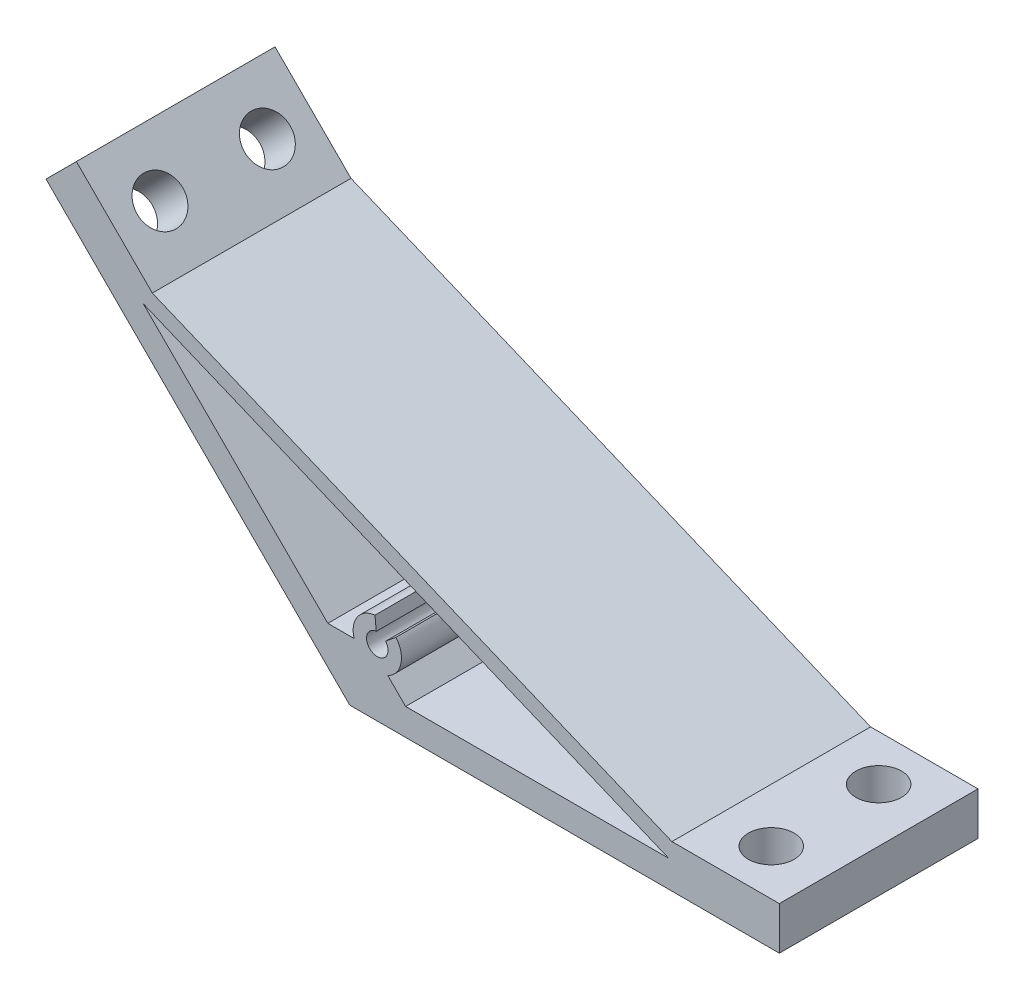
ISO-10303-21;
HEADER;
FILE_DESCRIPTION(('STEP AP214'),'2;1');
FILE_NAME('part.step','',(''),(''),'','','');
FILE_SCHEMA(('AUTOMOTIVE_DESIGN { 1 0 10303 214 1 1 1 1 }'));
ENDSEC;
DATA;
#1=APPLICATION_CONTEXT('core data for automotive mechanical design processes');
#2=APPLICATION_PROTOCOL_DEFINITION('international standard','automotive_design',2000,#1);
#3=PRODUCT_CONTEXT('',#1,'mechanical');
#4=PRODUCT('Part','Part','',(#3));
#5=PRODUCT_RELATED_PRODUCT_CATEGORY('part','',(#4));
#6=PRODUCT_DEFINITION_FORMATION('','',#4);
#7=PRODUCT_DEFINITION_CONTEXT('part definition',#1,'design');
#8=PRODUCT_DEFINITION('design','',#6,#7);
#9=PRODUCT_DEFINITION_SHAPE('','',#8);
#10=(LENGTH_UNIT() NAMED_UNIT(*) SI_UNIT(.MILLI.,.METRE.));
#11=(NAMED_UNIT(*) PLANE_ANGLE_UNIT() SI_UNIT($,.RADIAN.));
#12=(NAMED_UNIT(*) SI_UNIT($,.STERADIAN.) SOLID_ANGLE_UNIT());
#13=UNCERTAINTY_MEASURE_WITH_UNIT(LENGTH_MEASURE(1.E-05),#10,'distance_accuracy_value','');
#14=(GEOMETRIC_REPRESENTATION_CONTEXT(3) GLOBAL_UNCERTAINTY_ASSIGNED_CONTEXT((#13)) GLOBAL_UNIT_ASSIGNED_CONTEXT((#10,
#11,#12)) REPRESENTATION_CONTEXT('',''));
#15=CARTESIAN_POINT('',(0.,0.,0.));
#16=DIRECTION('',(0.,0.,1.));
#17=DIRECTION('',(1.,0.,0.));
#18=AXIS2_PLACEMENT_3D('',#15,#16,#17);
#19=CARTESIAN_POINT('',(580.06230191566,1400.39427630612,18.5));
#20=DIRECTION('',(0.382683432365095,0.923879532511285,0.));
#21=DIRECTION('',(-0.923879532511285,0.382683432365095,0.));
#22=AXIS2_PLACEMENT_3D('',#19,#20,#21);
#23=PLANE('',#22);
#24=DIRECTION('',(0.923879532511285,-0.382683432365095,0.));
#25=VECTOR('',#24,1.);
#26=CARTESIAN_POINT('',(580.06230191566,1400.39427630612,-18.5));
#27=LINE('',#26,#25);
#28=CARTESIAN_POINT('',(6955.91811216156,-1240.57167203307,-18.5));
#29=VERTEX_POINT('',#28);
#30=CARTESIAN_POINT('',(7052.68766478326,-1280.65493315376,-18.5));
#31=VERTEX_POINT('',#30);
#32=EDGE_CURVE('E233',#29,#31,#27,.T.);
#33=ORIENTED_EDGE('',*,*,#32,.F.);
#34=DIRECTION('',(0.,0.,-1.));
#35=VECTOR('',#34,1.);
#36=CARTESIAN_POINT('',(6955.91811216156,-1240.57167203307,18.5));
#37=LINE('',#36,#35);
#38=CARTESIAN_POINT('',(6955.91811216156,-1240.57167203307,18.5));
#39=VERTEX_POINT('',#38);
#40=EDGE_CURVE('E11',#39,#29,#37,.T.);
#41=ORIENTED_EDGE('',*,*,#40,.F.);
#42=DIRECTION('',(0.923879532511285,-0.382683432365095,0.));
#43=VECTOR('',#42,1.);
#44=CARTESIAN_POINT('',(580.06230191566,1400.39427630612,18.5));
#45=LINE('',#44,#43);
#46=CARTESIAN_POINT('',(7052.68766478326,-1280.65493315376,18.5));
#47=VERTEX_POINT('',#46);
#48=EDGE_CURVE('E270',#39,#47,#45,.T.);
#49=ORIENTED_EDGE('',*,*,#48,.T.);
#50=DIRECTION('',(0.,0.,-1.));
#51=VECTOR('',#50,1.);
#52=CARTESIAN_POINT('',(7052.68766478326,-1280.65493315376,18.5));
#53=LINE('',#52,#51);
#54=EDGE_CURVE('E54',#47,#31,#53,.T.);
#55=ORIENTED_EDGE('',*,*,#54,.T.);
#56=EDGE_LOOP('',(#33,#41,#49,#55));
#57=FACE_BOUND('',#56,.T.);
#58=ADVANCED_FACE('F35',(#57),#23,.T.);
#59=CARTESIAN_POINT('',(2857.67322006435,2857.67322006426,18.5));
#60=DIRECTION('',(-0.707106781186559,-0.707106781186536,0.));
#61=DIRECTION('',(0.707106781186536,-0.707106781186559,0.));
#62=AXIS2_PLACEMENT_3D('',#59,#60,#61);
#63=PLANE('',#62);
#64=CARTESIAN_POINT('',(6948.84704434969,-1233.50060422121,-10.));
#65=DIRECTION('',(-0.707106781186559,-0.707106781186536,0.));
#66=DIRECTION('',(0.707106781186536,-0.707106781186559,0.));
#67=AXIS2_PLACEMENT_3D('',#64,#65,#66);
#68=CIRCLE('',#67,4.24999999999998);
#69=CARTESIAN_POINT('',(6951.85224816974,-1236.50580804125,-10.));
#70=VERTEX_POINT('',#69);
#71=EDGE_CURVE('E299',#70,#70,#68,.T.);
#72=ORIENTED_EDGE('',*,*,#71,.T.);
#73=EDGE_LOOP('',(#72));
#74=FACE_BOUND('',#73,.T.);
#75=CARTESIAN_POINT('',(6948.84704434969,-1233.50060422121,10.));
#76=DIRECTION('',(-0.707106781186559,-0.707106781186536,0.));
#77=DIRECTION('',(0.707106781186536,-0.707106781186559,0.));
#78=AXIS2_PLACEMENT_3D('',#75,#76,#77);
#79=CIRCLE('',#78,4.24999999999998);
#80=CARTESIAN_POINT('',(6951.85224816974,-1236.50580804125,10.));
#81=VERTEX_POINT('',#80);
#82=EDGE_CURVE('E262',#81,#81,#79,.T.);
#83=ORIENTED_EDGE('',*,*,#82,.T.);
#84=EDGE_LOOP('',(#83));
#85=FACE_BOUND('',#84,.T.);
#86=DIRECTION('',(-0.707106781186536,0.707106781186559,0.));
#87=VECTOR('',#86,1.);
#88=CARTESIAN_POINT('',(2857.67322006435,2857.67322006426,-18.5));
#89=LINE('',#88,#87);
#90=CARTESIAN_POINT('',(6941.77597653783,-1226.42953640934,-18.5));
#91=VERTEX_POINT('',#90);
#92=EDGE_CURVE('E230',#29,#91,#89,.T.);
#93=ORIENTED_EDGE('',*,*,#92,.T.);
#94=DIRECTION('',(0.,0.,-1.));
#95=VECTOR('',#94,1.);
#96=CARTESIAN_POINT('',(6941.77597653783,-1226.42953640934,18.5));
#97=LINE('',#96,#95);
#98=CARTESIAN_POINT('',(6941.77597653783,-1226.42953640934,18.5));
#99=VERTEX_POINT('',#98);
#100=EDGE_CURVE('E45',#99,#91,#97,.T.);
#101=ORIENTED_EDGE('',*,*,#100,.F.);
#102=DIRECTION('',(-0.707106781186536,0.707106781186559,0.));
#103=VECTOR('',#102,1.);
#104=CARTESIAN_POINT('',(2857.67322006435,2857.67322006426,18.5));
#105=LINE('',#104,#103);
#106=EDGE_CURVE('E268',#39,#99,#105,.T.);
#107=ORIENTED_EDGE('',*,*,#106,.F.);
#108=ORIENTED_EDGE('',*,*,#40,.T.);
#109=EDGE_LOOP('',(#93,#101,#107,#108));
#110=FACE_BOUND('',#109,.T.);
#111=ADVANCED_FACE('F332',(#74,#85,#110),#63,.F.);
#112=CARTESIAN_POINT('',(4084.10275647372,-4084.10275647356,18.5));
#113=DIRECTION('',(-0.707106781186561,0.707106781186534,0.));
#114=DIRECTION('',(-0.707106781186534,-0.707106781186561,0.));
#115=AXIS2_PLACEMENT_3D('',#112,#113,#114);
#116=PLANE('',#115);
#117=DIRECTION('',(0.707106781186534,0.707106781186561,0.));
#118=VECTOR('',#117,1.);
#119=CARTESIAN_POINT('',(4084.10275647372,-4084.10275647356,-18.5));
#120=LINE('',#119,#118);
#121=CARTESIAN_POINT('',(6936.11912228834,-1232.08639065884,-18.5));
#122=VERTEX_POINT('',#121);
#123=EDGE_CURVE('E227',#122,#91,#120,.T.);
#124=ORIENTED_EDGE('',*,*,#123,.F.);
#125=DIRECTION('',(0.,0.,-1.));
#126=VECTOR('',#125,1.);
#127=CARTESIAN_POINT('',(6936.11912228834,-1232.08639065884,18.5));
#128=LINE('',#127,#126);
#129=CARTESIAN_POINT('',(6936.11912228834,-1232.08639065884,18.5));
#130=VERTEX_POINT('',#129);
#131=EDGE_CURVE('E187',#130,#122,#128,.T.);
#132=ORIENTED_EDGE('',*,*,#131,.F.);
#133=DIRECTION('',(0.707106781186534,0.707106781186561,0.));
#134=VECTOR('',#133,1.);
#135=CARTESIAN_POINT('',(4084.10275647372,-4084.10275647356,18.5));
#136=LINE('',#135,#134);
#137=EDGE_CURVE('E265',#130,#99,#136,.T.);
#138=ORIENTED_EDGE('',*,*,#137,.T.);
#139=ORIENTED_EDGE('',*,*,#100,.T.);
#140=EDGE_LOOP('',(#124,#132,#138,#139));
#141=FACE_BOUND('',#140,.T.);
#142=ADVANCED_FACE('F338',(#141),#116,.T.);
#143=CARTESIAN_POINT('',(2852.0163658146,2852.01636581472,18.5));
#144=DIRECTION('',(-0.707106781186532,-0.707106781186563,0.));
#145=DIRECTION('',(0.707106781186563,-0.707106781186532,0.));
#146=AXIS2_PLACEMENT_3D('',#143,#144,#145);
#147=PLANE('',#146);
#148=CARTESIAN_POINT('',(6943.1901901002,-1239.1574584707,-10.));
#149=DIRECTION('',(-0.707106781186532,-0.707106781186563,0.));
#150=DIRECTION('',(0.707106781186563,-0.707106781186532,0.));
#151=AXIS2_PLACEMENT_3D('',#148,#149,#150);
#152=CIRCLE('',#151,4.24999999999999);
#153=CARTESIAN_POINT('',(6946.19539392024,-1242.16266229074,-10.));
#154=VERTEX_POINT('',#153);
#155=EDGE_CURVE('E302',#154,#154,#152,.T.);
#156=ORIENTED_EDGE('',*,*,#155,.F.);
#157=EDGE_LOOP('',(#156));
#158=FACE_BOUND('',#157,.T.);
#159=CARTESIAN_POINT('',(6943.1901901002,-1239.1574584707,10.));
#160=DIRECTION('',(-0.707106781186532,-0.707106781186563,0.));
#161=DIRECTION('',(0.707106781186563,-0.707106781186532,0.));
#162=AXIS2_PLACEMENT_3D('',#159,#160,#161);
#163=CIRCLE('',#162,4.24999999999999);
#164=CARTESIAN_POINT('',(6946.19539392024,-1242.16266229074,10.));
#165=VERTEX_POINT('',#164);
#166=EDGE_CURVE('E296',#165,#165,#163,.T.);
#167=ORIENTED_EDGE('',*,*,#166,.F.);
#168=EDGE_LOOP('',(#167));
#169=FACE_BOUND('',#168,.T.);
#170=DIRECTION('',(-0.707106781186563,0.707106781186532,0.));
#171=VECTOR('',#170,1.);
#172=CARTESIAN_POINT('',(2852.0163658146,2852.01636581472,-18.5));
#173=LINE('',#172,#171);
#174=CARTESIAN_POINT('',(6992.68766478326,-1288.65493315376,-18.5));
#175=VERTEX_POINT('',#174);
#176=EDGE_CURVE('E224',#175,#122,#173,.T.);
#177=ORIENTED_EDGE('',*,*,#176,.F.);
#178=DIRECTION('',(0.,0.,-1.));
#179=VECTOR('',#178,1.);
#180=CARTESIAN_POINT('',(6992.68766478326,-1288.65493315376,18.5));
#181=LINE('',#180,#179);
#182=CARTESIAN_POINT('',(6992.68766478326,-1288.65493315376,18.5));
#183=VERTEX_POINT('',#182);
#184=EDGE_CURVE('E185',#183,#175,#181,.T.);
#185=ORIENTED_EDGE('',*,*,#184,.F.);
#186=DIRECTION('',(-0.707106781186563,0.707106781186532,0.));
#187=VECTOR('',#186,1.);
#188=CARTESIAN_POINT('',(2852.0163658146,2852.01636581472,18.5));
#189=LINE('',#188,#187);
#190=EDGE_CURVE('E179',#183,#130,#189,.T.);
#191=ORIENTED_EDGE('',*,*,#190,.T.);
#192=ORIENTED_EDGE('',*,*,#131,.T.);
#193=EDGE_LOOP('',(#177,#185,#191,#192));
#194=FACE_BOUND('',#193,.T.);
#195=ADVANCED_FACE('F336',(#158,#169,#194),#147,.T.);
#196=CARTESIAN_POINT('',(0.,-1288.65493315376,18.5));
#197=DIRECTION('',(0.,1.,0.));
#198=DIRECTION('',(0.,0.,1.));
#199=AXIS2_PLACEMENT_3D('',#196,#197,#198);
#200=PLANE('',#199);
#201=CARTESIAN_POINT('',(7062.68766478326,-1288.65493315377,-10.));
#202=DIRECTION('',(0.,-1.,0.));
#203=DIRECTION('',(0.,0.,-1.));
#204=AXIS2_PLACEMENT_3D('',#201,#202,#203);
#205=CIRCLE('',#204,4.24999999999986);
#206=CARTESIAN_POINT('',(7062.68766478326,-1288.65493315377,-14.2499999999999));
#207=VERTEX_POINT('',#206);
#208=EDGE_CURVE('E311',#207,#207,#205,.T.);
#209=ORIENTED_EDGE('',*,*,#208,.F.);
#210=EDGE_LOOP('',(#209));
#211=FACE_BOUND('',#210,.T.);
#212=CARTESIAN_POINT('',(7062.68766478326,-1288.65493315377,10.));
#213=DIRECTION('',(0.,-1.,0.));
#214=DIRECTION('',(0.,0.,-1.));
#215=AXIS2_PLACEMENT_3D('',#212,#213,#214);
#216=CIRCLE('',#215,4.24999999999986);
#217=CARTESIAN_POINT('',(7062.68766478326,-1288.65493315377,5.75000000000014));
#218=VERTEX_POINT('',#217);
#219=EDGE_CURVE('E308',#218,#218,#216,.T.);
#220=ORIENTED_EDGE('',*,*,#219,.F.);
#221=EDGE_LOOP('',(#220));
#222=FACE_BOUND('',#221,.T.);
#223=DIRECTION('',(1.,0.,0.));
#224=VECTOR('',#223,1.);
#225=CARTESIAN_POINT('',(0.,-1288.65493315376,-18.5));
#226=LINE('',#225,#224);
#227=CARTESIAN_POINT('',(7072.68766478326,-1288.65493315376,-18.5));
#228=VERTEX_POINT('',#227);
#229=EDGE_CURVE('E184',#175,#228,#226,.T.);
#230=ORIENTED_EDGE('',*,*,#229,.T.);
#231=DIRECTION('',(0.,0.,-1.));
#232=VECTOR('',#231,1.);
#233=CARTESIAN_POINT('',(7072.68766478326,-1288.65493315376,18.5));
#234=LINE('',#233,#232);
#235=CARTESIAN_POINT('',(7072.68766478326,-1288.65493315376,18.5));
#236=VERTEX_POINT('',#235);
#237=EDGE_CURVE('E166',#236,#228,#234,.T.);
#238=ORIENTED_EDGE('',*,*,#237,.F.);
#239=DIRECTION('',(1.,0.,0.));
#240=VECTOR('',#239,1.);
#241=CARTESIAN_POINT('',(0.,-1288.65493315376,18.5));
#242=LINE('',#241,#240);
#243=EDGE_CURVE('E171',#183,#236,#242,.T.);
#244=ORIENTED_EDGE('',*,*,#243,.F.);
#245=ORIENTED_EDGE('',*,*,#184,.T.);
#246=EDGE_LOOP('',(#230,#238,#244,#245));
#247=FACE_BOUND('',#246,.T.);
#248=ADVANCED_FACE('F182',(#211,#222,#247),#200,.F.);
#249=CARTESIAN_POINT('',(7072.68766478326,0.,18.5));
#250=DIRECTION('',(-1.,0.,0.));
#251=DIRECTION('',(0.,0.,1.));
#252=AXIS2_PLACEMENT_3D('',#249,#250,#251);
#253=PLANE('',#252);
#254=DIRECTION('',(0.,1.,0.));
#255=VECTOR('',#254,1.);
#256=CARTESIAN_POINT('',(7072.68766478326,0.,-18.5));
#257=LINE('',#256,#255);
#258=CARTESIAN_POINT('',(7072.68766478326,-1280.65493315376,-18.5));
#259=VERTEX_POINT('',#258);
#260=EDGE_CURVE('E221',#228,#259,#257,.T.);
#261=ORIENTED_EDGE('',*,*,#260,.T.);
#262=DIRECTION('',(0.,0.,-1.));
#263=VECTOR('',#262,1.);
#264=CARTESIAN_POINT('',(7072.68766478326,-1280.65493315376,18.5));
#265=LINE('',#264,#263);
#266=CARTESIAN_POINT('',(7072.68766478326,-1280.65493315376,18.5));
#267=VERTEX_POINT('',#266);
#268=EDGE_CURVE('E107',#267,#259,#265,.T.);
#269=ORIENTED_EDGE('',*,*,#268,.F.);
#270=DIRECTION('',(0.,1.,0.));
#271=VECTOR('',#270,1.);
#272=CARTESIAN_POINT('',(7072.68766478326,0.,18.5));
#273=LINE('',#272,#271);
#274=EDGE_CURVE('E162',#236,#267,#273,.T.);
#275=ORIENTED_EDGE('',*,*,#274,.F.);
#276=ORIENTED_EDGE('',*,*,#237,.T.);
#277=EDGE_LOOP('',(#261,#269,#275,#276));
#278=FACE_BOUND('',#277,.T.);
#279=ADVANCED_FACE('F164',(#278),#253,.F.);
#280=CARTESIAN_POINT('',(6997.82073881189,-1276.26412007604,18.5));
#281=DIRECTION('',(0.,0.,-1.));
#282=DIRECTION('',(-1.,0.,0.));
#283=AXIS2_PLACEMENT_3D('',#280,#281,#282);
#284=CYLINDRICAL_SURFACE('',#283,1.99999999999993);
#285=CARTESIAN_POINT('',(6997.82073881189,-1276.26412007604,-18.5));
#286=DIRECTION('',(0.,0.,1.));
#287=DIRECTION('',(1.,0.,0.));
#288=AXIS2_PLACEMENT_3D('',#285,#286,#287);
#289=CIRCLE('',#288,1.99999999999993);
#290=CARTESIAN_POINT('',(6997.62653003943,-1274.27357167103,-18.5));
#291=VERTEX_POINT('',#290);
#292=CARTESIAN_POINT('',(6999.36559542733,-1274.99391614055,-18.5));
#293=VERTEX_POINT('',#292);
#294=EDGE_CURVE('E259',#291,#293,#289,.T.);
#295=ORIENTED_EDGE('',*,*,#294,.F.);
#296=DIRECTION('',(0.,0.,-1.));
#297=VECTOR('',#296,1.);
#298=CARTESIAN_POINT('',(6997.62653003943,-1274.27357167103,18.5));
#299=LINE('',#298,#297);
#300=CARTESIAN_POINT('',(6997.62653003943,-1274.27357167103,18.5));
#301=VERTEX_POINT('',#300);
#302=EDGE_CURVE('E119',#301,#291,#299,.T.);
#303=ORIENTED_EDGE('',*,*,#302,.F.);
#304=CARTESIAN_POINT('',(6997.82073881189,-1276.26412007604,18.5));
#305=DIRECTION('',(0.,0.,1.));
#306=DIRECTION('',(1.,0.,0.));
#307=AXIS2_PLACEMENT_3D('',#304,#305,#306);
#308=CIRCLE('',#307,1.99999999999993);
#309=CARTESIAN_POINT('',(6999.36559542733,-1274.99391614055,18.5));
#310=VERTEX_POINT('',#309);
#311=EDGE_CURVE('E220',#301,#310,#308,.T.);
#312=ORIENTED_EDGE('',*,*,#311,.T.);
#313=DIRECTION('',(0.,0.,-1.));
#314=VECTOR('',#313,1.);
#315=CARTESIAN_POINT('',(6999.36559542733,-1274.99391614055,18.5));
#316=LINE('',#315,#314);
#317=EDGE_CURVE('E194',#310,#293,#316,.T.);
#318=ORIENTED_EDGE('',*,*,#317,.T.);
#319=EDGE_LOOP('',(#295,#303,#312,#318));
#320=FACE_BOUND('',#319,.T.);
#321=ADVANCED_FACE('F37',(#320),#284,.F.);
#322=CARTESIAN_POINT('',(6808.49128288336,664.273589646761,18.5));
#323=DIRECTION('',(-0.9952742025064,-0.0971043862307417,0.));
#324=DIRECTION('',(0.0971043862307417,-0.9952742025064,0.));
#325=AXIS2_PLACEMENT_3D('',#322,#323,#324);
#326=PLANE('',#325);
#327=DIRECTION('',(-0.0971043862307417,0.9952742025064,0.));
#328=VECTOR('',#327,1.);
#329=CARTESIAN_POINT('',(6808.49128288336,664.273589646761,-18.5));
#330=LINE('',#329,#328);
#331=CARTESIAN_POINT('',(6997.38376907385,-1271.78538616476,-18.5));
#332=VERTEX_POINT('',#331);
#333=EDGE_CURVE('E257',#291,#332,#330,.T.);
#334=ORIENTED_EDGE('',*,*,#333,.T.);
#335=DIRECTION('',(0.,0.,-1.));
#336=VECTOR('',#335,1.);
#337=CARTESIAN_POINT('',(6997.38376907385,-1271.78538616476,18.5));
#338=LINE('',#337,#336);
#339=CARTESIAN_POINT('',(6997.38376907385,-1271.78538616476,18.5));
#340=VERTEX_POINT('',#339);
#341=EDGE_CURVE('E212',#340,#332,#338,.T.);
#342=ORIENTED_EDGE('',*,*,#341,.F.);
#343=DIRECTION('',(-0.0971043862307417,0.9952742025064,0.));
#344=VECTOR('',#343,1.);
#345=CARTESIAN_POINT('',(6808.49128288336,664.273589646761,18.5));
#346=LINE('',#345,#344);
#347=EDGE_CURVE('E291',#301,#340,#346,.T.);
#348=ORIENTED_EDGE('',*,*,#347,.F.);
#349=ORIENTED_EDGE('',*,*,#302,.T.);
#350=EDGE_LOOP('',(#334,#342,#348,#349));
#351=FACE_BOUND('',#350,.T.);
#352=ADVANCED_FACE('F383',(#351),#326,.F.);
#353=CARTESIAN_POINT('',(6997.82073881189,-1276.26412007604,18.5));
#354=DIRECTION('',(0.,0.,-1.));
#355=DIRECTION('',(-1.,0.,0.));
#356=AXIS2_PLACEMENT_3D('',#353,#354,#355);
#357=CYLINDRICAL_SURFACE('',#356,4.49999999999951);
#358=CARTESIAN_POINT('',(6997.82073881189,-1276.26412007604,-18.5));
#359=DIRECTION('',(0.,0.,1.));
#360=DIRECTION('',(1.,0.,0.));
#361=AXIS2_PLACEMENT_3D('',#358,#359,#360);
#362=CIRCLE('',#361,4.49999999999951);
#363=CARTESIAN_POINT('',(6993.49338103034,-1277.49861374974,-18.5));
#364=VERTEX_POINT('',#363);
#365=EDGE_CURVE('E254',#332,#364,#362,.T.);
#366=ORIENTED_EDGE('',*,*,#365,.T.);
#367=DIRECTION('',(0.,0.,-1.));
#368=VECTOR('',#367,1.);
#369=CARTESIAN_POINT('',(6993.49338103034,-1277.49861374974,18.5));
#370=LINE('',#369,#368);
#371=CARTESIAN_POINT('',(6993.49338103034,-1277.49861374974,18.5));
#372=VERTEX_POINT('',#371);
#373=EDGE_CURVE('E210',#372,#364,#370,.T.);
#374=ORIENTED_EDGE('',*,*,#373,.F.);
#375=CARTESIAN_POINT('',(6997.82073881189,-1276.26412007604,18.5));
#376=DIRECTION('',(0.,0.,1.));
#377=DIRECTION('',(1.,0.,0.));
#378=AXIS2_PLACEMENT_3D('',#375,#376,#377);
#379=CIRCLE('',#378,4.49999999999951);
#380=EDGE_CURVE('E289',#340,#372,#379,.T.);
#381=ORIENTED_EDGE('',*,*,#380,.F.);
#382=ORIENTED_EDGE('',*,*,#341,.T.);
#383=EDGE_LOOP('',(#366,#374,#381,#382));
#384=FACE_BOUND('',#383,.T.);
#385=ADVANCED_FACE('F380',(#384),#357,.T.);
#386=CARTESIAN_POINT('',(1.15994087185971E-09,-1277.49861375609,18.5));
#387=DIRECTION('',(-9.079781843749E-13,1.,0.));
#388=DIRECTION('',(-1.,-9.079781843749E-13,0.));
#389=AXIS2_PLACEMENT_3D('',#386,#387,#388);
#390=PLANE('',#389);
#391=DIRECTION('',(1.,9.079781843749E-13,0.));
#392=VECTOR('',#391,1.);
#393=CARTESIAN_POINT('',(1.15994087185971E-09,-1277.49861375609,-18.5));
#394=LINE('',#393,#392);
#395=CARTESIAN_POINT('',(6988.60241319111,-1277.49861374974,-18.5));
#396=VERTEX_POINT('',#395);
#397=EDGE_CURVE('E251',#396,#364,#394,.T.);
#398=ORIENTED_EDGE('',*,*,#397,.F.);
#399=DIRECTION('',(0.,0.,-1.));
#400=VECTOR('',#399,1.);
#401=CARTESIAN_POINT('',(6988.60241319111,-1277.49861374974,18.5));
#402=LINE('',#401,#400);
#403=CARTESIAN_POINT('',(6988.60241319111,-1277.49861374974,18.5));
#404=VERTEX_POINT('',#403);
#405=EDGE_CURVE('E208',#404,#396,#402,.T.);
#406=ORIENTED_EDGE('',*,*,#405,.F.);
#407=DIRECTION('',(1.,9.079781843749E-13,0.));
#408=VECTOR('',#407,1.);
#409=CARTESIAN_POINT('',(1.15994087185971E-09,-1277.49861375609,18.5));
#410=LINE('',#409,#408);
#411=EDGE_CURVE('E286',#404,#372,#410,.T.);
#412=ORIENTED_EDGE('',*,*,#411,.T.);
#413=ORIENTED_EDGE('',*,*,#373,.T.);
#414=EDGE_LOOP('',(#398,#406,#412,#413));
#415=FACE_BOUND('',#414,.T.);
#416=ADVANCED_FACE('F376',(#415),#390,.T.);
#417=CARTESIAN_POINT('',(2855.55189972073,2855.55189972069,18.5));
#418=DIRECTION('',(-0.707106781186552,-0.707106781186543,0.));
#419=DIRECTION('',(0.707106781186543,-0.707106781186552,0.));
#420=AXIS2_PLACEMENT_3D('',#417,#418,#419);
#421=PLANE('',#420);
#422=DIRECTION('',(-0.707106781186543,0.707106781186552,0.));
#423=VECTOR('',#422,1.);
#424=CARTESIAN_POINT('',(2855.55189972073,2855.55189972069,-18.5));
#425=LINE('',#424,#423);
#426=CARTESIAN_POINT('',(6954.21874866951,-1243.11494922814,-18.5));
#427=VERTEX_POINT('',#426);
#428=EDGE_CURVE('E249',#396,#427,#425,.T.);
#429=ORIENTED_EDGE('',*,*,#428,.T.);
#430=DIRECTION('',(0.,0.,-1.));
#431=VECTOR('',#430,1.);
#432=CARTESIAN_POINT('',(6954.21874866951,-1243.11494922814,18.5));
#433=LINE('',#432,#431);
#434=CARTESIAN_POINT('',(6954.21874866951,-1243.11494922814,18.5));
#435=VERTEX_POINT('',#434);
#436=EDGE_CURVE('E205',#435,#427,#433,.T.);
#437=ORIENTED_EDGE('',*,*,#436,.F.);
#438=DIRECTION('',(-0.707106781186543,0.707106781186552,0.));
#439=VECTOR('',#438,1.);
#440=CARTESIAN_POINT('',(2855.55189972073,2855.55189972069,18.5));
#441=LINE('',#440,#439);
#442=EDGE_CURVE('E284',#404,#435,#441,.T.);
#443=ORIENTED_EDGE('',*,*,#442,.F.);
#444=ORIENTED_EDGE('',*,*,#405,.T.);
#445=EDGE_LOOP('',(#429,#437,#443,#444));
#446=FACE_BOUND('',#445,.T.);
#447=ADVANCED_FACE('F372',(#446),#421,.F.);
#448=CARTESIAN_POINT('',(578.914251618586,1397.62263770862,18.5));
#449=DIRECTION('',(0.3826834323651,0.923879532511283,0.));
#450=DIRECTION('',(-0.923879532511283,0.3826834323651,0.));
#451=AXIS2_PLACEMENT_3D('',#448,#449,#450);
#452=PLANE('',#451);
#453=DIRECTION('',(0.923879532511283,-0.3826834323651,0.));
#454=VECTOR('',#453,1.);
#455=CARTESIAN_POINT('',(578.914251618586,1397.62263770862,-18.5));
#456=LINE('',#455,#454);
#457=CARTESIAN_POINT('',(7052.09092768112,-1283.65493315376,-18.5));
#458=VERTEX_POINT('',#457);
#459=EDGE_CURVE('E246',#427,#458,#456,.T.);
#460=ORIENTED_EDGE('',*,*,#459,.T.);
#461=DIRECTION('',(0.,0.,-1.));
#462=VECTOR('',#461,1.);
#463=CARTESIAN_POINT('',(7052.09092768112,-1283.65493315376,18.5));
#464=LINE('',#463,#462);
#465=CARTESIAN_POINT('',(7052.09092768112,-1283.65493315376,18.5));
#466=VERTEX_POINT('',#465);
#467=EDGE_CURVE('E203',#466,#458,#464,.T.);
#468=ORIENTED_EDGE('',*,*,#467,.F.);
#469=DIRECTION('',(0.923879532511283,-0.3826834323651,0.));
#470=VECTOR('',#469,1.);
#471=CARTESIAN_POINT('',(578.914251618586,1397.62263770862,18.5));
#472=LINE('',#471,#470);
#473=EDGE_CURVE('E282',#435,#466,#472,.T.);
#474=ORIENTED_EDGE('',*,*,#473,.F.);
#475=ORIENTED_EDGE('',*,*,#436,.T.);
#476=EDGE_LOOP('',(#460,#468,#474,#475));
#477=FACE_BOUND('',#476,.T.);
#478=ADVANCED_FACE('F368',(#477),#452,.F.);
#479=CARTESIAN_POINT('',(-5.8169112753506E-12,-1283.65493315373,18.5));
#480=DIRECTION('',(0.,1.,0.));
#481=DIRECTION('',(-1.,0.,0.));
#482=AXIS2_PLACEMENT_3D('',#479,#480,#481);
#483=PLANE('',#482);
#484=DIRECTION('',(1.,0.,0.));
#485=VECTOR('',#484,1.);
#486=CARTESIAN_POINT('',(-5.8169112753506E-12,-1283.65493315373,-18.5));
#487=LINE('',#486,#485);
#488=CARTESIAN_POINT('',(7003.09092768112,-1283.65493315376,-18.5));
#489=VERTEX_POINT('',#488);
#490=EDGE_CURVE('E243',#489,#458,#487,.T.);
#491=ORIENTED_EDGE('',*,*,#490,.F.);
#492=DIRECTION('',(0.,0.,-1.));
#493=VECTOR('',#492,1.);
#494=CARTESIAN_POINT('',(7003.09092768112,-1283.65493315376,18.5));
#495=LINE('',#494,#493);
#496=CARTESIAN_POINT('',(7003.09092768112,-1283.65493315376,18.5));
#497=VERTEX_POINT('',#496);
#498=EDGE_CURVE('E201',#497,#489,#495,.T.);
#499=ORIENTED_EDGE('',*,*,#498,.F.);
#500=DIRECTION('',(1.,0.,0.));
#501=VECTOR('',#500,1.);
#502=CARTESIAN_POINT('',(-5.8169112753506E-12,-1283.65493315373,18.5));
#503=LINE('',#502,#501);
#504=EDGE_CURVE('E279',#497,#466,#503,.T.);
#505=ORIENTED_EDGE('',*,*,#504,.T.);
#506=ORIENTED_EDGE('',*,*,#467,.T.);
#507=EDGE_LOOP('',(#491,#499,#505,#506));
#508=FACE_BOUND('',#507,.T.);
#509=ADVANCED_FACE('F364',(#508),#483,.T.);
#510=CARTESIAN_POINT('',(2859.71799726508,2859.71799726394,18.5));
#511=DIRECTION('',(-0.707106781186689,-0.707106781186406,0.));
#512=DIRECTION('',(0.707106781186406,-0.707106781186689,0.));
#513=AXIS2_PLACEMENT_3D('',#510,#511,#512);
#514=PLANE('',#513);
#515=DIRECTION('',(-0.707106781186406,0.707106781186689,0.));
#516=VECTOR('',#515,1.);
#517=CARTESIAN_POINT('',(2859.71799726508,2859.71799726394,-18.5));
#518=LINE('',#517,#516);
#519=CARTESIAN_POINT('',(6999.76054974539,-1280.32455521803,-18.5));
#520=VERTEX_POINT('',#519);
#521=EDGE_CURVE('E241',#489,#520,#518,.T.);
#522=ORIENTED_EDGE('',*,*,#521,.T.);
#523=DIRECTION('',(0.,0.,-1.));
#524=VECTOR('',#523,1.);
#525=CARTESIAN_POINT('',(6999.76054974539,-1280.32455521803,18.5));
#526=LINE('',#525,#524);
#527=CARTESIAN_POINT('',(6999.76054974539,-1280.32455521803,18.5));
#528=VERTEX_POINT('',#527);
#529=EDGE_CURVE('E198',#528,#520,#526,.T.);
#530=ORIENTED_EDGE('',*,*,#529,.F.);
#531=DIRECTION('',(-0.707106781186406,0.707106781186689,0.));
#532=VECTOR('',#531,1.);
#533=CARTESIAN_POINT('',(2859.71799726508,2859.71799726394,18.5));
#534=LINE('',#533,#532);
#535=EDGE_CURVE('E277',#497,#528,#534,.T.);
#536=ORIENTED_EDGE('',*,*,#535,.F.);
#537=ORIENTED_EDGE('',*,*,#498,.T.);
#538=EDGE_LOOP('',(#522,#530,#536,#537));
#539=FACE_BOUND('',#538,.T.);
#540=ADVANCED_FACE('F360',(#539),#514,.F.);
#541=CARTESIAN_POINT('',(6997.82073881189,-1276.26412007604,18.5));
#542=DIRECTION('',(0.,0.,-1.));
#543=DIRECTION('',(-1.,0.,0.));
#544=AXIS2_PLACEMENT_3D('',#541,#542,#543);
#545=CYLINDRICAL_SURFACE('',#544,4.50000000000019);
#546=CARTESIAN_POINT('',(6997.82073881189,-1276.26412007604,-18.5));
#547=DIRECTION('',(0.,0.,1.));
#548=DIRECTION('',(1.,0.,0.));
#549=AXIS2_PLACEMENT_3D('',#546,#547,#548);
#550=CIRCLE('',#549,4.50000000000019);
#551=CARTESIAN_POINT('',(7001.29666619663,-1273.40616122119,-18.5));
#552=VERTEX_POINT('',#551);
#553=EDGE_CURVE('E238',#520,#552,#550,.T.);
#554=ORIENTED_EDGE('',*,*,#553,.T.);
#555=DIRECTION('',(0.,0.,-1.));
#556=VECTOR('',#555,1.);
#557=CARTESIAN_POINT('',(7001.29666619663,-1273.40616122119,18.5));
#558=LINE('',#557,#556);
#559=CARTESIAN_POINT('',(7001.29666619663,-1273.40616122119,18.5));
#560=VERTEX_POINT('',#559);
#561=EDGE_CURVE('E196',#560,#552,#558,.T.);
#562=ORIENTED_EDGE('',*,*,#561,.F.);
#563=CARTESIAN_POINT('',(6997.82073881189,-1276.26412007604,18.5));
#564=DIRECTION('',(0.,0.,1.));
#565=DIRECTION('',(1.,0.,0.));
#566=AXIS2_PLACEMENT_3D('',#563,#564,#565);
#567=CIRCLE('',#566,4.50000000000019);
#568=EDGE_CURVE('E275',#528,#560,#567,.T.);
#569=ORIENTED_EDGE('',*,*,#568,.F.);
#570=ORIENTED_EDGE('',*,*,#529,.T.);
#571=EDGE_LOOP('',(#554,#562,#569,#570));
#572=FACE_BOUND('',#571,.T.);
#573=ADVANCED_FACE('F356',(#572),#545,.T.);
#574=CARTESIAN_POINT('',(3448.70038270471,-4194.40331746767,18.5));
#575=DIRECTION('',(-0.63510196774562,0.772428307719002,0.));
#576=DIRECTION('',(-0.772428307719002,-0.63510196774562,0.));
#577=AXIS2_PLACEMENT_3D('',#574,#575,#576);
#578=PLANE('',#577);
#579=DIRECTION('',(0.772428307719002,0.63510196774562,0.));
#580=VECTOR('',#579,1.);
#581=CARTESIAN_POINT('',(3448.70038270471,-4194.40331746767,-18.5));
#582=LINE('',#581,#580);
#583=EDGE_CURVE('E235',#293,#552,#582,.T.);
#584=ORIENTED_EDGE('',*,*,#583,.F.);
#585=ORIENTED_EDGE('',*,*,#317,.F.);
#586=DIRECTION('',(0.772428307719002,0.63510196774562,0.));
#587=VECTOR('',#586,1.);
#588=CARTESIAN_POINT('',(3448.70038270471,-4194.40331746767,18.5));
#589=LINE('',#588,#587);
#590=EDGE_CURVE('E272',#310,#560,#589,.T.);
#591=ORIENTED_EDGE('',*,*,#590,.T.);
#592=ORIENTED_EDGE('',*,*,#561,.T.);
#593=EDGE_LOOP('',(#584,#585,#591,#592));
#594=FACE_BOUND('',#593,.T.);
#595=ADVANCED_FACE('F323',(#594),#578,.T.);
#596=CARTESIAN_POINT('',(0.,-1280.65493315376,18.5));
#597=DIRECTION('',(0.,1.,0.));
#598=DIRECTION('',(0.,0.,1.));
#599=AXIS2_PLACEMENT_3D('',#596,#597,#598);
#600=PLANE('',#599);
#601=CARTESIAN_POINT('',(7062.68766478326,-1280.65493315376,-10.));
#602=DIRECTION('',(0.,1.,0.));
#603=DIRECTION('',(0.,0.,1.));
#604=AXIS2_PLACEMENT_3D('',#601,#602,#603);
#605=CIRCLE('',#604,4.24999999999986);
#606=CARTESIAN_POINT('',(7062.68766478326,-1280.65493315376,-5.75000000000013));
#607=VERTEX_POINT('',#606);
#608=EDGE_CURVE('E39',#607,#607,#605,.T.);
#609=ORIENTED_EDGE('',*,*,#608,.F.);
#610=EDGE_LOOP('',(#609));
#611=FACE_BOUND('',#610,.T.);
#612=CARTESIAN_POINT('',(7062.68766478326,-1280.65493315376,10.));
#613=DIRECTION('',(0.,1.,0.));
#614=DIRECTION('',(0.,0.,1.));
#615=AXIS2_PLACEMENT_3D('',#612,#613,#614);
#616=CIRCLE('',#615,4.24999999999986);
#617=CARTESIAN_POINT('',(7062.68766478326,-1280.65493315376,14.2499999999999));
#618=VERTEX_POINT('',#617);
#619=EDGE_CURVE('E305',#618,#618,#616,.T.);
#620=ORIENTED_EDGE('',*,*,#619,.F.);
#621=EDGE_LOOP('',(#620));
#622=FACE_BOUND('',#621,.T.);
#623=DIRECTION('',(1.,0.,0.));
#624=VECTOR('',#623,1.);
#625=CARTESIAN_POINT('',(0.,-1280.65493315376,-18.5));
#626=LINE('',#625,#624);
#627=EDGE_CURVE('E217',#31,#259,#626,.T.);
#628=ORIENTED_EDGE('',*,*,#627,.F.);
#629=ORIENTED_EDGE('',*,*,#54,.F.);
#630=DIRECTION('',(1.,0.,0.));
#631=VECTOR('',#630,1.);
#632=CARTESIAN_POINT('',(0.,-1280.65493315376,18.5));
#633=LINE('',#632,#631);
#634=EDGE_CURVE('E170',#47,#267,#633,.T.);
#635=ORIENTED_EDGE('',*,*,#634,.T.);
#636=ORIENTED_EDGE('',*,*,#268,.T.);
#637=EDGE_LOOP('',(#628,#629,#635,#636));
#638=FACE_BOUND('',#637,.T.);
#639=ADVANCED_FACE('F320',(#611,#622,#638),#600,.T.);
#640=CARTESIAN_POINT('',(0.,0.,18.5));
#641=DIRECTION('',(0.,0.,1.));
#642=DIRECTION('',(1.,0.,0.));
#643=AXIS2_PLACEMENT_3D('',#640,#641,#642);
#644=PLANE('',#643);
#645=ORIENTED_EDGE('',*,*,#311,.F.);
#646=ORIENTED_EDGE('',*,*,#347,.T.);
#647=ORIENTED_EDGE('',*,*,#380,.T.);
#648=ORIENTED_EDGE('',*,*,#411,.F.);
#649=ORIENTED_EDGE('',*,*,#442,.T.);
#650=ORIENTED_EDGE('',*,*,#473,.T.);
#651=ORIENTED_EDGE('',*,*,#504,.F.);
#652=ORIENTED_EDGE('',*,*,#535,.T.);
#653=ORIENTED_EDGE('',*,*,#568,.T.);
#654=ORIENTED_EDGE('',*,*,#590,.F.);
#655=EDGE_LOOP('',(#645,#646,#647,#648,#649,#650,#651,#652,#653,#654));
#656=FACE_BOUND('',#655,.T.);
#657=ORIENTED_EDGE('',*,*,#48,.F.);
#658=ORIENTED_EDGE('',*,*,#106,.T.);
#659=ORIENTED_EDGE('',*,*,#137,.F.);
#660=ORIENTED_EDGE('',*,*,#190,.F.);
#661=ORIENTED_EDGE('',*,*,#243,.T.);
#662=ORIENTED_EDGE('',*,*,#274,.T.);
#663=ORIENTED_EDGE('',*,*,#634,.F.);
#664=EDGE_LOOP('',(#657,#658,#659,#660,#661,#662,#663));
#665=FACE_BOUND('',#664,.T.);
#666=ADVANCED_FACE('F176',(#656,#665),#644,.T.);
#667=CARTESIAN_POINT('',(0.,0.,-18.5));
#668=DIRECTION('',(0.,0.,1.));
#669=DIRECTION('',(1.,0.,0.));
#670=AXIS2_PLACEMENT_3D('',#667,#668,#669);
#671=PLANE('',#670);
#672=ORIENTED_EDGE('',*,*,#294,.T.);
#673=ORIENTED_EDGE('',*,*,#583,.T.);
#674=ORIENTED_EDGE('',*,*,#553,.F.);
#675=ORIENTED_EDGE('',*,*,#521,.F.);
#676=ORIENTED_EDGE('',*,*,#490,.T.);
#677=ORIENTED_EDGE('',*,*,#459,.F.);
#678=ORIENTED_EDGE('',*,*,#428,.F.);
#679=ORIENTED_EDGE('',*,*,#397,.T.);
#680=ORIENTED_EDGE('',*,*,#365,.F.);
#681=ORIENTED_EDGE('',*,*,#333,.F.);
#682=EDGE_LOOP('',(#672,#673,#674,#675,#676,#677,#678,#679,#680,#681));
#683=FACE_BOUND('',#682,.T.);
#684=ORIENTED_EDGE('',*,*,#32,.T.);
#685=ORIENTED_EDGE('',*,*,#627,.T.);
#686=ORIENTED_EDGE('',*,*,#260,.F.);
#687=ORIENTED_EDGE('',*,*,#229,.F.);
#688=ORIENTED_EDGE('',*,*,#176,.T.);
#689=ORIENTED_EDGE('',*,*,#123,.T.);
#690=ORIENTED_EDGE('',*,*,#92,.F.);
#691=EDGE_LOOP('',(#684,#685,#686,#687,#688,#689,#690));
#692=FACE_BOUND('',#691,.T.);
#693=ADVANCED_FACE('F327',(#683,#692),#671,.F.);
#694=CARTESIAN_POINT('',(6943.1901901002,-1239.1574584707,10.));
#695=DIRECTION('',(-0.707106781186532,-0.707106781186563,0.));
#696=DIRECTION('',(0.707106781186563,-0.707106781186532,0.));
#697=AXIS2_PLACEMENT_3D('',#694,#695,#696);
#698=CYLINDRICAL_SURFACE('',#697,4.24999999999998);
#699=ORIENTED_EDGE('',*,*,#166,.T.);
#700=EDGE_LOOP('',(#699));
#701=FACE_BOUND('',#700,.T.);
#702=ORIENTED_EDGE('',*,*,#82,.F.);
#703=EDGE_LOOP('',(#702));
#704=FACE_BOUND('',#703,.T.);
#705=ADVANCED_FACE('F419',(#701,#704),#698,.F.);
#706=CARTESIAN_POINT('',(6943.1901901002,-1239.1574584707,-10.));
#707=DIRECTION('',(-0.707106781186532,-0.707106781186563,0.));
#708=DIRECTION('',(0.707106781186563,-0.707106781186532,0.));
#709=AXIS2_PLACEMENT_3D('',#706,#707,#708);
#710=CYLINDRICAL_SURFACE('',#709,4.24999999999998);
#711=ORIENTED_EDGE('',*,*,#155,.T.);
#712=EDGE_LOOP('',(#711));
#713=FACE_BOUND('',#712,.T.);
#714=ORIENTED_EDGE('',*,*,#71,.F.);
#715=EDGE_LOOP('',(#714));
#716=FACE_BOUND('',#715,.T.);
#717=ADVANCED_FACE('F435',(#713,#716),#710,.F.);
#718=CARTESIAN_POINT('',(7062.68766478326,-1288.65493315377,10.));
#719=DIRECTION('',(0.,-1.,0.));
#720=DIRECTION('',(0.,0.,-1.));
#721=AXIS2_PLACEMENT_3D('',#718,#719,#720);
#722=CYLINDRICAL_SURFACE('',#721,4.24999999999986);
#723=ORIENTED_EDGE('',*,*,#619,.T.);
#724=EDGE_LOOP('',(#723));
#725=FACE_BOUND('',#724,.T.);
#726=ORIENTED_EDGE('',*,*,#219,.T.);
#727=EDGE_LOOP('',(#726));
#728=FACE_BOUND('',#727,.T.);
#729=ADVANCED_FACE('F433',(#725,#728),#722,.F.);
#730=CARTESIAN_POINT('',(7062.68766478326,-1288.65493315377,-10.));
#731=DIRECTION('',(0.,-1.,0.));
#732=DIRECTION('',(0.,0.,-1.));
#733=AXIS2_PLACEMENT_3D('',#730,#731,#732);
#734=CYLINDRICAL_SURFACE('',#733,4.24999999999986);
#735=ORIENTED_EDGE('',*,*,#608,.T.);
#736=EDGE_LOOP('',(#735));
#737=FACE_BOUND('',#736,.T.);
#738=ORIENTED_EDGE('',*,*,#208,.T.);
#739=EDGE_LOOP('',(#738));
#740=FACE_BOUND('',#739,.T.);
#741=ADVANCED_FACE('F318',(#737,#740),#734,.F.);
#742=CLOSED_SHELL('',(#58,#111,#142,#195,#248,#279,#321,#352,#385,#416,#447,#478,#509,#540,#573,
#595,#639,#666,#693,#705,#717,#729,#741));
#743=MANIFOLD_SOLID_BREP('B2',#742);
#744=ADVANCED_BREP_SHAPE_REPRESENTATION('',(#18,#743),#14);
#745=SHAPE_DEFINITION_REPRESENTATION(#9,#744);
ENDSEC;
END-ISO-10303-21;
